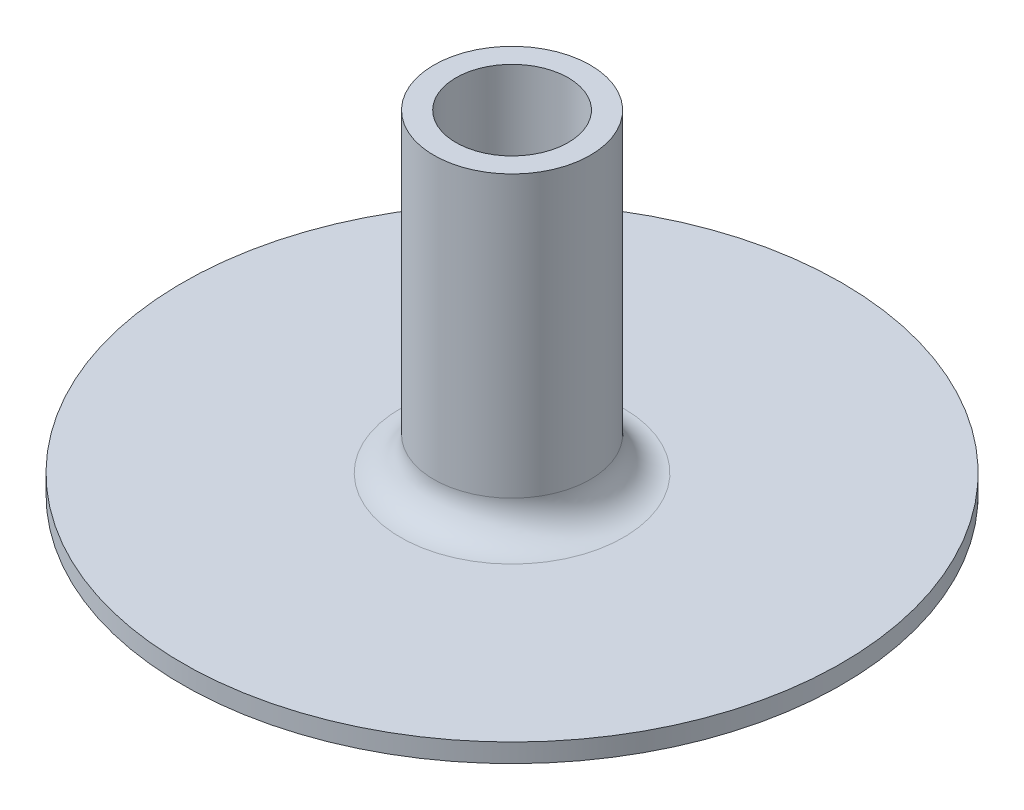
ISO-10303-21;
HEADER;
FILE_DESCRIPTION(('STEP AP214'),'2;1');
FILE_NAME('part.step','',(''),(''),'','','');
FILE_SCHEMA(('AUTOMOTIVE_DESIGN { 1 0 10303 214 1 1 1 1 }'));
ENDSEC;
DATA;
#1=APPLICATION_CONTEXT('core data for automotive mechanical design processes');
#2=APPLICATION_PROTOCOL_DEFINITION('international standard','automotive_design',2000,#1);
#3=PRODUCT_CONTEXT('',#1,'mechanical');
#4=PRODUCT('Part','Part','',(#3));
#5=PRODUCT_RELATED_PRODUCT_CATEGORY('part','',(#4));
#6=PRODUCT_DEFINITION_FORMATION('','',#4);
#7=PRODUCT_DEFINITION_CONTEXT('part definition',#1,'design');
#8=PRODUCT_DEFINITION('design','',#6,#7);
#9=PRODUCT_DEFINITION_SHAPE('','',#8);
#10=(LENGTH_UNIT() NAMED_UNIT(*) SI_UNIT(.MILLI.,.METRE.));
#11=(NAMED_UNIT(*) PLANE_ANGLE_UNIT() SI_UNIT($,.RADIAN.));
#12=(NAMED_UNIT(*) SI_UNIT($,.STERADIAN.) SOLID_ANGLE_UNIT());
#13=UNCERTAINTY_MEASURE_WITH_UNIT(LENGTH_MEASURE(1.E-05),#10,'distance_accuracy_value','');
#14=(GEOMETRIC_REPRESENTATION_CONTEXT(3) GLOBAL_UNCERTAINTY_ASSIGNED_CONTEXT((#13)) GLOBAL_UNIT_ASSIGNED_CONTEXT((#10,
#11,#12)) REPRESENTATION_CONTEXT('',''));
#15=CARTESIAN_POINT('',(0.,0.,0.));
#16=DIRECTION('',(0.,0.,1.));
#17=DIRECTION('',(1.,0.,0.));
#18=AXIS2_PLACEMENT_3D('',#15,#16,#17);
#19=CARTESIAN_POINT('',(-6.2611,0.,0.));
#20=DIRECTION('',(0.,1.,0.));
#21=DIRECTION('',(0.,0.,1.));
#22=AXIS2_PLACEMENT_3D('',#19,#20,#21);
#23=PLANE('',#22);
#24=CARTESIAN_POINT('',(0.,0.,0.));
#25=DIRECTION('',(0.,1.,0.));
#26=DIRECTION('',(0.,0.,1.));
#27=AXIS2_PLACEMENT_3D('',#24,#25,#26);
#28=CIRCLE('',#27,1.7018);
#29=CARTESIAN_POINT('',(0.,0.,1.7018));
#30=VERTEX_POINT('',#29);
#31=EDGE_CURVE('E41',#30,#30,#28,.T.);
#32=ORIENTED_EDGE('',*,*,#31,.T.);
#33=EDGE_LOOP('',(#32));
#34=FACE_BOUND('',#33,.T.);
#35=CARTESIAN_POINT('',(0.,0.,0.));
#36=DIRECTION('',(0.,-1.,0.));
#37=DIRECTION('',(0.,0.,-1.));
#38=AXIS2_PLACEMENT_3D('',#35,#36,#37);
#39=CIRCLE('',#38,6.2611);
#40=CARTESIAN_POINT('',(0.,0.,-6.2611));
#41=VERTEX_POINT('',#40);
#42=EDGE_CURVE('E59',#41,#41,#39,.T.);
#43=ORIENTED_EDGE('',*,*,#42,.T.);
#44=EDGE_LOOP('',(#43));
#45=FACE_BOUND('',#44,.T.);
#46=ADVANCED_FACE('F30',(#34,#45),#23,.F.);
#47=CARTESIAN_POINT('',(0.,0.,0.));
#48=DIRECTION('',(0.,-1.,0.));
#49=DIRECTION('',(0.,0.,-1.));
#50=AXIS2_PLACEMENT_3D('',#47,#48,#49);
#51=CYLINDRICAL_SURFACE('',#50,1.0668);
#52=CARTESIAN_POINT('',(0.,0.635,0.));
#53=DIRECTION('',(0.,1.,0.));
#54=DIRECTION('',(0.,0.,1.));
#55=AXIS2_PLACEMENT_3D('',#52,#53,#54);
#56=CIRCLE('',#55,1.0668);
#57=CARTESIAN_POINT('',(0.,0.635,1.0668));
#58=VERTEX_POINT('',#57);
#59=EDGE_CURVE('E45',#58,#58,#56,.F.);
#60=ORIENTED_EDGE('',*,*,#59,.T.);
#61=EDGE_LOOP('',(#60));
#62=FACE_BOUND('',#61,.T.);
#63=CARTESIAN_POINT('',(0.,6.3246,0.));
#64=DIRECTION('',(0.,-1.,0.));
#65=DIRECTION('',(0.,0.,-1.));
#66=AXIS2_PLACEMENT_3D('',#63,#64,#65);
#67=CIRCLE('',#66,1.0668);
#68=CARTESIAN_POINT('',(0.,6.3246,-1.0668));
#69=VERTEX_POINT('',#68);
#70=EDGE_CURVE('E50',#69,#69,#67,.T.);
#71=ORIENTED_EDGE('',*,*,#70,.F.);
#72=EDGE_LOOP('',(#71));
#73=FACE_BOUND('',#72,.T.);
#74=ADVANCED_FACE('F81',(#62,#73),#51,.F.);
#75=CARTESIAN_POINT('',(-1.0668,6.3246,0.));
#76=DIRECTION('',(0.,-1.,0.));
#77=DIRECTION('',(0.,0.,-1.));
#78=AXIS2_PLACEMENT_3D('',#75,#76,#77);
#79=PLANE('',#78);
#80=CARTESIAN_POINT('',(0.,6.3246,0.));
#81=DIRECTION('',(0.,-1.,0.));
#82=DIRECTION('',(0.,0.,-1.));
#83=AXIS2_PLACEMENT_3D('',#80,#81,#82);
#84=CIRCLE('',#83,1.4859);
#85=CARTESIAN_POINT('',(0.,6.3246,-1.4859));
#86=VERTEX_POINT('',#85);
#87=EDGE_CURVE('E53',#86,#86,#84,.T.);
#88=ORIENTED_EDGE('',*,*,#87,.F.);
#89=EDGE_LOOP('',(#88));
#90=FACE_BOUND('',#89,.T.);
#91=ORIENTED_EDGE('',*,*,#70,.T.);
#92=EDGE_LOOP('',(#91));
#93=FACE_BOUND('',#92,.T.);
#94=ADVANCED_FACE('F78',(#90,#93),#79,.F.);
#95=CARTESIAN_POINT('',(0.,0.,0.));
#96=DIRECTION('',(0.,-1.,0.));
#97=DIRECTION('',(0.,0.,-1.));
#98=AXIS2_PLACEMENT_3D('',#95,#96,#97);
#99=CYLINDRICAL_SURFACE('',#98,1.4859);
#100=CARTESIAN_POINT('',(0.,0.9906,0.));
#101=DIRECTION('',(0.,-1.,0.));
#102=DIRECTION('',(0.,0.,-1.));
#103=AXIS2_PLACEMENT_3D('',#100,#101,#102);
#104=CIRCLE('',#103,1.4859);
#105=CARTESIAN_POINT('',(0.,0.9906,-1.4859));
#106=VERTEX_POINT('',#105);
#107=EDGE_CURVE('E10',#106,#106,#104,.F.);
#108=ORIENTED_EDGE('',*,*,#107,.T.);
#109=EDGE_LOOP('',(#108));
#110=FACE_BOUND('',#109,.T.);
#111=ORIENTED_EDGE('',*,*,#87,.T.);
#112=EDGE_LOOP('',(#111));
#113=FACE_BOUND('',#112,.T.);
#114=ADVANCED_FACE('F73',(#110,#113),#99,.T.);
#115=CARTESIAN_POINT('',(-1.4859,0.3556,0.));
#116=DIRECTION('',(0.,-1.,0.));
#117=DIRECTION('',(0.,0.,-1.));
#118=AXIS2_PLACEMENT_3D('',#115,#116,#117);
#119=PLANE('',#118);
#120=CARTESIAN_POINT('',(0.,0.3556,0.));
#121=DIRECTION('',(0.,-1.,0.));
#122=DIRECTION('',(0.,0.,-1.));
#123=AXIS2_PLACEMENT_3D('',#120,#121,#122);
#124=CIRCLE('',#123,2.1209);
#125=CARTESIAN_POINT('',(0.,0.3556,-2.1209));
#126=VERTEX_POINT('',#125);
#127=EDGE_CURVE('E37',#126,#126,#124,.T.);
#128=ORIENTED_EDGE('',*,*,#127,.T.);
#129=EDGE_LOOP('',(#128));
#130=FACE_BOUND('',#129,.T.);
#131=CARTESIAN_POINT('',(0.,0.3556,0.));
#132=DIRECTION('',(0.,-1.,0.));
#133=DIRECTION('',(0.,0.,-1.));
#134=AXIS2_PLACEMENT_3D('',#131,#132,#133);
#135=CIRCLE('',#134,6.2611);
#136=CARTESIAN_POINT('',(0.,0.3556,-6.2611));
#137=VERTEX_POINT('',#136);
#138=EDGE_CURVE('E56',#137,#137,#135,.T.);
#139=ORIENTED_EDGE('',*,*,#138,.F.);
#140=EDGE_LOOP('',(#139));
#141=FACE_BOUND('',#140,.T.);
#142=ADVANCED_FACE('F68',(#130,#141),#119,.F.);
#143=CARTESIAN_POINT('',(0.,0.,0.));
#144=DIRECTION('',(0.,-1.,0.));
#145=DIRECTION('',(0.,0.,-1.));
#146=AXIS2_PLACEMENT_3D('',#143,#144,#145);
#147=CYLINDRICAL_SURFACE('',#146,6.2611);
#148=ORIENTED_EDGE('',*,*,#42,.F.);
#149=EDGE_LOOP('',(#148));
#150=FACE_BOUND('',#149,.T.);
#151=ORIENTED_EDGE('',*,*,#138,.T.);
#152=EDGE_LOOP('',(#151));
#153=FACE_BOUND('',#152,.T.);
#154=ADVANCED_FACE('F64',(#150,#153),#147,.T.);
#155=CARTESIAN_POINT('',(0.,0.635,0.));
#156=DIRECTION('',(0.,1.,0.));
#157=DIRECTION('',(0.,0.,1.));
#158=AXIS2_PLACEMENT_3D('',#155,#156,#157);
#159=TOROIDAL_SURFACE('',#158,1.7018,0.635);
#160=ORIENTED_EDGE('',*,*,#31,.F.);
#161=EDGE_LOOP('',(#160));
#162=FACE_BOUND('',#161,.T.);
#163=ORIENTED_EDGE('',*,*,#59,.F.);
#164=EDGE_LOOP('',(#163));
#165=FACE_BOUND('',#164,.T.);
#166=ADVANCED_FACE('F67',(#162,#165),#159,.T.);
#167=CARTESIAN_POINT('',(0.,0.9906,0.));
#168=DIRECTION('',(0.,-1.,0.));
#169=DIRECTION('',(0.,0.,-1.));
#170=AXIS2_PLACEMENT_3D('',#167,#168,#169);
#171=TOROIDAL_SURFACE('',#170,2.1209,0.635);
#172=ORIENTED_EDGE('',*,*,#107,.F.);
#173=EDGE_LOOP('',(#172));
#174=FACE_BOUND('',#173,.T.);
#175=ORIENTED_EDGE('',*,*,#127,.F.);
#176=EDGE_LOOP('',(#175));
#177=FACE_BOUND('',#176,.T.);
#178=ADVANCED_FACE('F32',(#174,#177),#171,.F.);
#179=CLOSED_SHELL('',(#46,#74,#94,#114,#142,#154,#166,#178));
#180=MANIFOLD_SOLID_BREP('B2',#179);
#181=ADVANCED_BREP_SHAPE_REPRESENTATION('',(#18,#180),#14);
#182=SHAPE_DEFINITION_REPRESENTATION(#9,#181);
ENDSEC;
END-ISO-10303-21;
